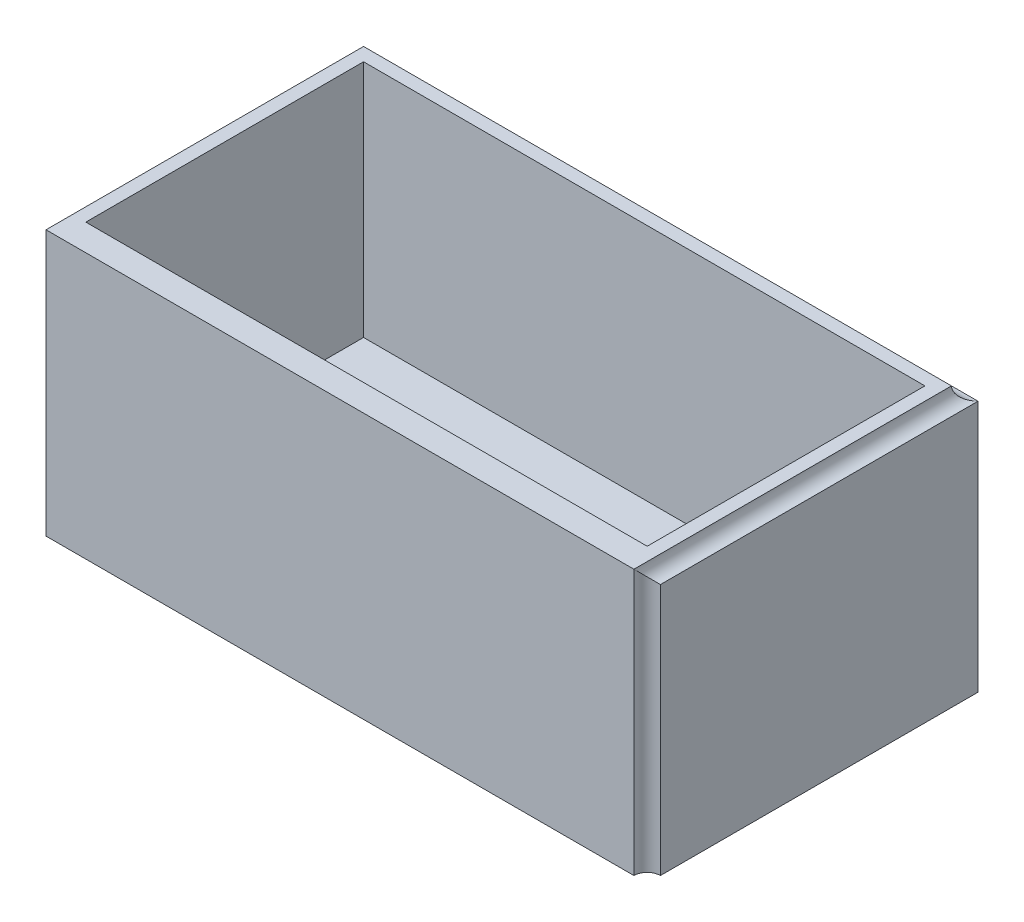
ISO-10303-21;
HEADER;
FILE_DESCRIPTION(('STEP AP214'),'2;1');
FILE_NAME('part.step','',(''),(''),'','','');
FILE_SCHEMA(('AUTOMOTIVE_DESIGN { 1 0 10303 214 1 1 1 1 }'));
ENDSEC;
DATA;
#1=APPLICATION_CONTEXT('core data for automotive mechanical design processes');
#2=APPLICATION_PROTOCOL_DEFINITION('international standard','automotive_design',2000,#1);
#3=PRODUCT_CONTEXT('',#1,'mechanical');
#4=PRODUCT('Part','Part','',(#3));
#5=PRODUCT_RELATED_PRODUCT_CATEGORY('part','',(#4));
#6=PRODUCT_DEFINITION_FORMATION('','',#4);
#7=PRODUCT_DEFINITION_CONTEXT('part definition',#1,'design');
#8=PRODUCT_DEFINITION('design','',#6,#7);
#9=PRODUCT_DEFINITION_SHAPE('','',#8);
#10=(LENGTH_UNIT() NAMED_UNIT(*) SI_UNIT(.MILLI.,.METRE.));
#11=(NAMED_UNIT(*) PLANE_ANGLE_UNIT() SI_UNIT($,.RADIAN.));
#12=(NAMED_UNIT(*) SI_UNIT($,.STERADIAN.) SOLID_ANGLE_UNIT());
#13=UNCERTAINTY_MEASURE_WITH_UNIT(LENGTH_MEASURE(1.E-05),#10,'distance_accuracy_value','');
#14=(GEOMETRIC_REPRESENTATION_CONTEXT(3) GLOBAL_UNCERTAINTY_ASSIGNED_CONTEXT((#13)) GLOBAL_UNIT_ASSIGNED_CONTEXT((#10,
#11,#12)) REPRESENTATION_CONTEXT('',''));
#15=CARTESIAN_POINT('',(0.,0.,0.));
#16=DIRECTION('',(0.,0.,1.));
#17=DIRECTION('',(1.,0.,0.));
#18=AXIS2_PLACEMENT_3D('',#15,#16,#17);
#19=CARTESIAN_POINT('',(-116.457407054503,50.,59.3396888919688));
#20=DIRECTION('',(0.,0.,-1.));
#21=DIRECTION('',(-1.,0.,0.));
#22=AXIS2_PLACEMENT_3D('',#19,#20,#21);
#23=PLANE('',#22);
#24=DIRECTION('',(0.,-1.,0.));
#25=VECTOR('',#24,1.);
#26=CARTESIAN_POINT('',(-111.457407054503,55.6,59.3396888919688));
#27=LINE('',#26,#25);
#28=CARTESIAN_POINT('',(-111.457407054503,-50.,59.3396888919688));
#29=VERTEX_POINT('',#28);
#30=CARTESIAN_POINT('',(-111.457407054503,50.,59.3396888919688));
#31=VERTEX_POINT('',#30);
#32=EDGE_CURVE('E200',#29,#31,#27,.F.);
#33=ORIENTED_EDGE('',*,*,#32,.F.);
#34=DIRECTION('',(1.,0.,0.));
#35=VECTOR('',#34,1.);
#36=CARTESIAN_POINT('',(-116.457407054503,-50.,59.3396888919688));
#37=LINE('',#36,#35);
#38=CARTESIAN_POINT('',(110.150365448953,-50.,59.3396888919688));
#39=VERTEX_POINT('',#38);
#40=EDGE_CURVE('E161',#29,#39,#37,.T.);
#41=ORIENTED_EDGE('',*,*,#40,.T.);
#42=DIRECTION('',(0.,1.,0.));
#43=VECTOR('',#42,1.);
#44=CARTESIAN_POINT('',(110.150365448953,-55.0000000000003,59.3396888919688));
#45=LINE('',#44,#43);
#46=CARTESIAN_POINT('',(110.150365448953,50.,59.3396888919688));
#47=VERTEX_POINT('',#46);
#48=EDGE_CURVE('E141',#47,#39,#45,.F.);
#49=ORIENTED_EDGE('',*,*,#48,.F.);
#50=DIRECTION('',(1.,0.,0.));
#51=VECTOR('',#50,1.);
#52=CARTESIAN_POINT('',(-116.457407054503,50.,59.3396888919688));
#53=LINE('',#52,#51);
#54=EDGE_CURVE('E163',#31,#47,#53,.T.);
#55=ORIENTED_EDGE('',*,*,#54,.F.);
#56=EDGE_LOOP('',(#33,#41,#49,#55));
#57=FACE_BOUND('',#56,.T.);
#58=ADVANCED_FACE('F51',(#57),#23,.F.);
#59=CARTESIAN_POINT('',(115.150365448953,50.,-65.3520802774987));
#60=DIRECTION('',(-1.,0.,0.));
#61=DIRECTION('',(0.,0.,1.));
#62=AXIS2_PLACEMENT_3D('',#59,#60,#61);
#63=PLANE('',#62);
#64=DIRECTION('',(0.,0.,-1.));
#65=VECTOR('',#64,1.);
#66=CARTESIAN_POINT('',(115.150365448953,45.,64.9396888919689));
#67=LINE('',#66,#65);
#68=CARTESIAN_POINT('',(115.150365448953,45.,54.3396888919688));
#69=VERTEX_POINT('',#68);
#70=CARTESIAN_POINT('',(115.150365448953,45.,-65.3520802774987));
#71=VERTEX_POINT('',#70);
#72=EDGE_CURVE('E155',#69,#71,#67,.T.);
#73=ORIENTED_EDGE('',*,*,#72,.F.);
#74=DIRECTION('',(0.,1.,0.));
#75=VECTOR('',#74,1.);
#76=CARTESIAN_POINT('',(115.150365448953,-55.0000000000003,54.3396888919688));
#77=LINE('',#76,#75);
#78=CARTESIAN_POINT('',(115.150365448953,-50.,54.3396888919688));
#79=VERTEX_POINT('',#78);
#80=EDGE_CURVE('E138',#79,#69,#77,.T.);
#81=ORIENTED_EDGE('',*,*,#80,.F.);
#82=DIRECTION('',(0.,0.,-1.));
#83=VECTOR('',#82,1.);
#84=CARTESIAN_POINT('',(115.150365448953,-50.,-65.3520802774987));
#85=LINE('',#84,#83);
#86=CARTESIAN_POINT('',(115.150365448953,-50.,-65.3520802774987));
#87=VERTEX_POINT('',#86);
#88=EDGE_CURVE('E153',#79,#87,#85,.T.);
#89=ORIENTED_EDGE('',*,*,#88,.T.);
#90=DIRECTION('',(0.,-1.,0.));
#91=VECTOR('',#90,1.);
#92=CARTESIAN_POINT('',(115.150365448953,50.,-65.3520802774987));
#93=LINE('',#92,#91);
#94=EDGE_CURVE('E171',#71,#87,#93,.T.);
#95=ORIENTED_EDGE('',*,*,#94,.F.);
#96=EDGE_LOOP('',(#73,#81,#89,#95));
#97=FACE_BOUND('',#96,.T.);
#98=ADVANCED_FACE('F151',(#97),#63,.F.);
#99=CARTESIAN_POINT('',(0.,-50.,0.));
#100=DIRECTION('',(0.,1.,0.));
#101=DIRECTION('',(0.,0.,1.));
#102=AXIS2_PLACEMENT_3D('',#99,#100,#101);
#103=PLANE('',#102);
#104=ORIENTED_EDGE('',*,*,#40,.F.);
#105=CARTESIAN_POINT('',(-116.457407054503,-50.,59.3396888919688));
#106=DIRECTION('',(0.,1.,0.));
#107=DIRECTION('',(0.,0.,1.));
#108=AXIS2_PLACEMENT_3D('',#105,#106,#107);
#109=CIRCLE('',#108,5.);
#110=CARTESIAN_POINT('',(-116.457407054503,-50.,54.3396888919688));
#111=VERTEX_POINT('',#110);
#112=EDGE_CURVE('E193',#29,#111,#109,.T.);
#113=ORIENTED_EDGE('',*,*,#112,.T.);
#114=DIRECTION('',(0.,0.,1.));
#115=VECTOR('',#114,1.);
#116=CARTESIAN_POINT('',(-116.457407054503,-50.,-65.3520802774987));
#117=LINE('',#116,#115);
#118=CARTESIAN_POINT('',(-116.457407054503,-50.,-65.3520802774987));
#119=VERTEX_POINT('',#118);
#120=EDGE_CURVE('E165',#119,#111,#117,.T.);
#121=ORIENTED_EDGE('',*,*,#120,.F.);
#122=DIRECTION('',(-1.,0.,0.));
#123=VECTOR('',#122,1.);
#124=CARTESIAN_POINT('',(-116.457407054503,-50.,-65.3520802774987));
#125=LINE('',#124,#123);
#126=EDGE_CURVE('E160',#87,#119,#125,.T.);
#127=ORIENTED_EDGE('',*,*,#126,.F.);
#128=ORIENTED_EDGE('',*,*,#88,.F.);
#129=CARTESIAN_POINT('',(115.150365448953,-50.,59.3396888919688));
#130=DIRECTION('',(0.,1.,0.));
#131=DIRECTION('',(0.,0.,1.));
#132=AXIS2_PLACEMENT_3D('',#129,#130,#131);
#133=CIRCLE('',#132,5.);
#134=EDGE_CURVE('E134',#79,#39,#133,.T.);
#135=ORIENTED_EDGE('',*,*,#134,.T.);
#136=EDGE_LOOP('',(#104,#113,#121,#127,#128,#135));
#137=FACE_BOUND('',#136,.T.);
#138=ADVANCED_FACE('F157',(#137),#103,.F.);
#139=CARTESIAN_POINT('',(-116.457407054503,50.,-65.3520802774987));
#140=DIRECTION('',(1.,0.,0.));
#141=DIRECTION('',(0.,0.,-1.));
#142=AXIS2_PLACEMENT_3D('',#139,#140,#141);
#143=PLANE('',#142);
#144=DIRECTION('',(0.,-1.,0.));
#145=VECTOR('',#144,1.);
#146=CARTESIAN_POINT('',(-116.457407054503,55.6,54.3396888919688));
#147=LINE('',#146,#145);
#148=CARTESIAN_POINT('',(-116.457407054503,45.,54.3396888919688));
#149=VERTEX_POINT('',#148);
#150=EDGE_CURVE('E202',#149,#111,#147,.T.);
#151=ORIENTED_EDGE('',*,*,#150,.F.);
#152=DIRECTION('',(0.,0.,1.));
#153=VECTOR('',#152,1.);
#154=CARTESIAN_POINT('',(-116.457407054503,45.,-76.4520802774987));
#155=LINE('',#154,#153);
#156=CARTESIAN_POINT('',(-116.457407054503,45.,-65.3520802774987));
#157=VERTEX_POINT('',#156);
#158=EDGE_CURVE('E206',#157,#149,#155,.T.);
#159=ORIENTED_EDGE('',*,*,#158,.F.);
#160=DIRECTION('',(0.,-1.,0.));
#161=VECTOR('',#160,1.);
#162=CARTESIAN_POINT('',(-116.457407054503,50.,-65.3520802774987));
#163=LINE('',#162,#161);
#164=EDGE_CURVE('E169',#157,#119,#163,.T.);
#165=ORIENTED_EDGE('',*,*,#164,.T.);
#166=ORIENTED_EDGE('',*,*,#120,.T.);
#167=EDGE_LOOP('',(#151,#159,#165,#166));
#168=FACE_BOUND('',#167,.T.);
#169=ADVANCED_FACE('F53',(#168),#143,.F.);
#170=CARTESIAN_POINT('',(-116.457407054503,50.,-65.3520802774987));
#171=DIRECTION('',(0.,0.,1.));
#172=DIRECTION('',(1.,0.,0.));
#173=AXIS2_PLACEMENT_3D('',#170,#171,#172);
#174=PLANE('',#173);
#175=DIRECTION('',(-1.,0.,0.));
#176=VECTOR('',#175,1.);
#177=CARTESIAN_POINT('',(126.250365448953,45.,-65.3520802774987));
#178=LINE('',#177,#176);
#179=EDGE_CURVE('E186',#71,#157,#178,.T.);
#180=ORIENTED_EDGE('',*,*,#179,.F.);
#181=ORIENTED_EDGE('',*,*,#94,.T.);
#182=ORIENTED_EDGE('',*,*,#126,.T.);
#183=ORIENTED_EDGE('',*,*,#164,.F.);
#184=EDGE_LOOP('',(#180,#181,#182,#183));
#185=FACE_BOUND('',#184,.T.);
#186=ADVANCED_FACE('F250',(#185),#174,.F.);
#187=CARTESIAN_POINT('',(0.,50.,0.));
#188=DIRECTION('',(0.,1.,0.));
#189=DIRECTION('',(0.,0.,1.));
#190=AXIS2_PLACEMENT_3D('',#187,#188,#189);
#191=PLANE('',#190);
#192=DIRECTION('',(0.,0.,1.));
#193=VECTOR('',#192,1.);
#194=CARTESIAN_POINT('',(-106.457407054503,50.,-65.3520802774987));
#195=LINE('',#194,#193);
#196=CARTESIAN_POINT('',(-106.457407054503,50.,-55.3520802774987));
#197=VERTEX_POINT('',#196);
#198=CARTESIAN_POINT('',(-106.457407054503,50.,49.3396888919688));
#199=VERTEX_POINT('',#198);
#200=EDGE_CURVE('E228',#197,#199,#195,.T.);
#201=ORIENTED_EDGE('',*,*,#200,.F.);
#202=DIRECTION('',(-1.,0.,0.));
#203=VECTOR('',#202,1.);
#204=CARTESIAN_POINT('',(-116.457407054503,50.,-55.3520802774987));
#205=LINE('',#204,#203);
#206=CARTESIAN_POINT('',(105.150365448953,50.,-55.3520802774987));
#207=VERTEX_POINT('',#206);
#208=EDGE_CURVE('E219',#207,#197,#205,.T.);
#209=ORIENTED_EDGE('',*,*,#208,.F.);
#210=DIRECTION('',(0.,0.,-1.));
#211=VECTOR('',#210,1.);
#212=CARTESIAN_POINT('',(105.150365448953,50.,-65.3520802774987));
#213=LINE('',#212,#211);
#214=CARTESIAN_POINT('',(105.150365448953,50.,49.3396888919688));
#215=VERTEX_POINT('',#214);
#216=EDGE_CURVE('E232',#215,#207,#213,.T.);
#217=ORIENTED_EDGE('',*,*,#216,.F.);
#218=DIRECTION('',(1.,0.,0.));
#219=VECTOR('',#218,1.);
#220=CARTESIAN_POINT('',(-116.457407054503,50.,49.3396888919688));
#221=LINE('',#220,#219);
#222=EDGE_CURVE('E230',#199,#215,#221,.T.);
#223=ORIENTED_EDGE('',*,*,#222,.F.);
#224=EDGE_LOOP('',(#201,#209,#217,#223));
#225=FACE_BOUND('',#224,.T.);
#226=DIRECTION('',(-1.,0.,0.));
#227=VECTOR('',#226,1.);
#228=CARTESIAN_POINT('',(126.250365448953,50.,-60.3520802774987));
#229=LINE('',#228,#227);
#230=CARTESIAN_POINT('',(110.150365448953,50.,-60.3520802774987));
#231=VERTEX_POINT('',#230);
#232=CARTESIAN_POINT('',(-111.457407054503,50.,-60.3520802774987));
#233=VERTEX_POINT('',#232);
#234=EDGE_CURVE('E59',#231,#233,#229,.T.);
#235=ORIENTED_EDGE('',*,*,#234,.T.);
#236=DIRECTION('',(0.,0.,1.));
#237=VECTOR('',#236,1.);
#238=CARTESIAN_POINT('',(-111.457407054503,50.,-76.4520802774987));
#239=LINE('',#238,#237);
#240=EDGE_CURVE('E12',#233,#31,#239,.T.);
#241=ORIENTED_EDGE('',*,*,#240,.T.);
#242=ORIENTED_EDGE('',*,*,#54,.T.);
#243=DIRECTION('',(0.,0.,-1.));
#244=VECTOR('',#243,1.);
#245=CARTESIAN_POINT('',(110.150365448953,50.,64.9396888919689));
#246=LINE('',#245,#244);
#247=EDGE_CURVE('E173',#47,#231,#246,.T.);
#248=ORIENTED_EDGE('',*,*,#247,.T.);
#249=EDGE_LOOP('',(#235,#241,#242,#248));
#250=FACE_BOUND('',#249,.T.);
#251=ADVANCED_FACE('F177',(#225,#250),#191,.T.);
#252=CARTESIAN_POINT('',(-106.457407054503,50.,-65.3520802774987));
#253=DIRECTION('',(1.,0.,0.));
#254=DIRECTION('',(0.,0.,-1.));
#255=AXIS2_PLACEMENT_3D('',#252,#253,#254);
#256=PLANE('',#255);
#257=DIRECTION('',(0.,0.,1.));
#258=VECTOR('',#257,1.);
#259=CARTESIAN_POINT('',(-106.457407054503,-40.,-65.3520802774987));
#260=LINE('',#259,#258);
#261=CARTESIAN_POINT('',(-106.457407054503,-40.,-55.3520802774987));
#262=VERTEX_POINT('',#261);
#263=CARTESIAN_POINT('',(-106.457407054503,-40.,49.3396888919688));
#264=VERTEX_POINT('',#263);
#265=EDGE_CURVE('E208',#262,#264,#260,.T.);
#266=ORIENTED_EDGE('',*,*,#265,.F.);
#267=DIRECTION('',(0.,-1.,0.));
#268=VECTOR('',#267,1.);
#269=CARTESIAN_POINT('',(-106.457407054503,50.,-55.3520802774987));
#270=LINE('',#269,#268);
#271=EDGE_CURVE('E216',#197,#262,#270,.T.);
#272=ORIENTED_EDGE('',*,*,#271,.F.);
#273=ORIENTED_EDGE('',*,*,#200,.T.);
#274=DIRECTION('',(0.,-1.,0.));
#275=VECTOR('',#274,1.);
#276=CARTESIAN_POINT('',(-106.457407054503,50.,49.3396888919688));
#277=LINE('',#276,#275);
#278=EDGE_CURVE('E212',#199,#264,#277,.T.);
#279=ORIENTED_EDGE('',*,*,#278,.T.);
#280=EDGE_LOOP('',(#266,#272,#273,#279));
#281=FACE_BOUND('',#280,.T.);
#282=ADVANCED_FACE('F258',(#281),#256,.T.);
#283=CARTESIAN_POINT('',(-116.457407054503,50.,49.3396888919688));
#284=DIRECTION('',(0.,0.,-1.));
#285=DIRECTION('',(-1.,0.,0.));
#286=AXIS2_PLACEMENT_3D('',#283,#284,#285);
#287=PLANE('',#286);
#288=DIRECTION('',(1.,0.,0.));
#289=VECTOR('',#288,1.);
#290=CARTESIAN_POINT('',(-116.457407054503,-40.,49.3396888919688));
#291=LINE('',#290,#289);
#292=CARTESIAN_POINT('',(105.150365448953,-40.,49.3396888919688));
#293=VERTEX_POINT('',#292);
#294=EDGE_CURVE('E211',#264,#293,#291,.T.);
#295=ORIENTED_EDGE('',*,*,#294,.F.);
#296=ORIENTED_EDGE('',*,*,#278,.F.);
#297=ORIENTED_EDGE('',*,*,#222,.T.);
#298=DIRECTION('',(0.,-1.,0.));
#299=VECTOR('',#298,1.);
#300=CARTESIAN_POINT('',(105.150365448953,50.,49.3396888919688));
#301=LINE('',#300,#299);
#302=EDGE_CURVE('E215',#215,#293,#301,.T.);
#303=ORIENTED_EDGE('',*,*,#302,.T.);
#304=EDGE_LOOP('',(#295,#296,#297,#303));
#305=FACE_BOUND('',#304,.T.);
#306=ADVANCED_FACE('F271',(#305),#287,.T.);
#307=CARTESIAN_POINT('',(105.150365448953,50.,-65.3520802774987));
#308=DIRECTION('',(-1.,0.,0.));
#309=DIRECTION('',(0.,0.,1.));
#310=AXIS2_PLACEMENT_3D('',#307,#308,#309);
#311=PLANE('',#310);
#312=DIRECTION('',(0.,0.,-1.));
#313=VECTOR('',#312,1.);
#314=CARTESIAN_POINT('',(105.150365448953,-40.,-65.3520802774987));
#315=LINE('',#314,#313);
#316=CARTESIAN_POINT('',(105.150365448953,-40.,-55.3520802774987));
#317=VERTEX_POINT('',#316);
#318=EDGE_CURVE('E221',#293,#317,#315,.T.);
#319=ORIENTED_EDGE('',*,*,#318,.F.);
#320=ORIENTED_EDGE('',*,*,#302,.F.);
#321=ORIENTED_EDGE('',*,*,#216,.T.);
#322=DIRECTION('',(0.,-1.,0.));
#323=VECTOR('',#322,1.);
#324=CARTESIAN_POINT('',(105.150365448953,50.,-55.3520802774987));
#325=LINE('',#324,#323);
#326=EDGE_CURVE('E74',#207,#317,#325,.T.);
#327=ORIENTED_EDGE('',*,*,#326,.T.);
#328=EDGE_LOOP('',(#319,#320,#321,#327));
#329=FACE_BOUND('',#328,.T.);
#330=ADVANCED_FACE('F268',(#329),#311,.T.);
#331=CARTESIAN_POINT('',(-116.457407054503,50.,-55.3520802774987));
#332=DIRECTION('',(0.,0.,1.));
#333=DIRECTION('',(1.,0.,0.));
#334=AXIS2_PLACEMENT_3D('',#331,#332,#333);
#335=PLANE('',#334);
#336=DIRECTION('',(-1.,0.,0.));
#337=VECTOR('',#336,1.);
#338=CARTESIAN_POINT('',(-116.457407054503,-40.,-55.3520802774987));
#339=LINE('',#338,#337);
#340=EDGE_CURVE('E225',#317,#262,#339,.T.);
#341=ORIENTED_EDGE('',*,*,#340,.F.);
#342=ORIENTED_EDGE('',*,*,#326,.F.);
#343=ORIENTED_EDGE('',*,*,#208,.T.);
#344=ORIENTED_EDGE('',*,*,#271,.T.);
#345=EDGE_LOOP('',(#341,#342,#343,#344));
#346=FACE_BOUND('',#345,.T.);
#347=ADVANCED_FACE('F264',(#346),#335,.T.);
#348=CARTESIAN_POINT('',(0.,-40.,0.));
#349=DIRECTION('',(0.,1.,0.));
#350=DIRECTION('',(0.,0.,1.));
#351=AXIS2_PLACEMENT_3D('',#348,#349,#350);
#352=PLANE('',#351);
#353=ORIENTED_EDGE('',*,*,#265,.T.);
#354=ORIENTED_EDGE('',*,*,#294,.T.);
#355=ORIENTED_EDGE('',*,*,#318,.T.);
#356=ORIENTED_EDGE('',*,*,#340,.T.);
#357=EDGE_LOOP('',(#353,#354,#355,#356));
#358=FACE_BOUND('',#357,.T.);
#359=ADVANCED_FACE('F260',(#358),#352,.T.);
#360=CARTESIAN_POINT('',(-116.457407054503,50.,-76.4520802774987));
#361=DIRECTION('',(0.,0.,1.));
#362=DIRECTION('',(1.,0.,0.));
#363=AXIS2_PLACEMENT_3D('',#360,#361,#362);
#364=CYLINDRICAL_SURFACE('',#363,5.);
#365=ORIENTED_EDGE('',*,*,#158,.T.);
#366=CARTESIAN_POINT('',(-116.457407054503,50.,59.3396888919688));
#367=DIRECTION('',(0.,-0.707106781186548,0.707106781186548));
#368=DIRECTION('',(0.,0.707106781186548,0.707106781186548));
#369=AXIS2_PLACEMENT_3D('',#366,#367,#368);
#370=ELLIPSE('',#369,7.07106781186548,5.);
#371=EDGE_CURVE('E189',#149,#31,#370,.T.);
#372=ORIENTED_EDGE('',*,*,#371,.T.);
#373=ORIENTED_EDGE('',*,*,#240,.F.);
#374=CARTESIAN_POINT('',(-116.457407054503,50.,-65.3520802774987));
#375=DIRECTION('',(-0.707106781186548,0.,0.707106781186548));
#376=DIRECTION('',(-0.707106781186548,0.,-0.707106781186548));
#377=AXIS2_PLACEMENT_3D('',#374,#375,#376);
#378=ELLIPSE('',#377,7.07106781186548,5.);
#379=EDGE_CURVE('E185',#157,#233,#378,.T.);
#380=ORIENTED_EDGE('',*,*,#379,.F.);
#381=EDGE_LOOP('',(#365,#372,#373,#380));
#382=FACE_BOUND('',#381,.T.);
#383=ADVANCED_FACE('F263',(#382),#364,.F.);
#384=CARTESIAN_POINT('',(126.250365448953,50.,-65.3520802774987));
#385=DIRECTION('',(-1.,0.,0.));
#386=DIRECTION('',(0.,0.,1.));
#387=AXIS2_PLACEMENT_3D('',#384,#385,#386);
#388=CYLINDRICAL_SURFACE('',#387,5.);
#389=ORIENTED_EDGE('',*,*,#179,.T.);
#390=ORIENTED_EDGE('',*,*,#379,.T.);
#391=ORIENTED_EDGE('',*,*,#234,.F.);
#392=CARTESIAN_POINT('',(115.150365448953,50.,-65.3520802774987));
#393=DIRECTION('',(-0.707106781186548,0.,-0.707106781186548));
#394=DIRECTION('',(0.707106781186548,0.,-0.707106781186548));
#395=AXIS2_PLACEMENT_3D('',#392,#393,#394);
#396=ELLIPSE('',#395,7.07106781186548,5.);
#397=EDGE_CURVE('E66',#71,#231,#396,.T.);
#398=ORIENTED_EDGE('',*,*,#397,.F.);
#399=EDGE_LOOP('',(#389,#390,#391,#398));
#400=FACE_BOUND('',#399,.T.);
#401=ADVANCED_FACE('F182',(#400),#388,.F.);
#402=CARTESIAN_POINT('',(115.150365448953,50.,64.9396888919689));
#403=DIRECTION('',(0.,0.,-1.));
#404=DIRECTION('',(-1.,0.,0.));
#405=AXIS2_PLACEMENT_3D('',#402,#403,#404);
#406=CYLINDRICAL_SURFACE('',#405,5.);
#407=ORIENTED_EDGE('',*,*,#72,.T.);
#408=ORIENTED_EDGE('',*,*,#397,.T.);
#409=ORIENTED_EDGE('',*,*,#247,.F.);
#410=CARTESIAN_POINT('',(115.150365448953,50.,59.3396888919688));
#411=DIRECTION('',(0.,0.707106781186548,-0.707106781186548));
#412=DIRECTION('',(0.,0.707106781186548,0.707106781186548));
#413=AXIS2_PLACEMENT_3D('',#410,#411,#412);
#414=ELLIPSE('',#413,7.07106781186548,5.);
#415=EDGE_CURVE('E146',#69,#47,#414,.T.);
#416=ORIENTED_EDGE('',*,*,#415,.F.);
#417=EDGE_LOOP('',(#407,#408,#409,#416));
#418=FACE_BOUND('',#417,.T.);
#419=ADVANCED_FACE('F281',(#418),#406,.F.);
#420=CARTESIAN_POINT('',(-116.457407054503,55.6,59.3396888919688));
#421=DIRECTION('',(0.,-1.,0.));
#422=DIRECTION('',(0.,0.,-1.));
#423=AXIS2_PLACEMENT_3D('',#420,#421,#422);
#424=CYLINDRICAL_SURFACE('',#423,5.);
#425=ORIENTED_EDGE('',*,*,#150,.T.);
#426=ORIENTED_EDGE('',*,*,#112,.F.);
#427=ORIENTED_EDGE('',*,*,#32,.T.);
#428=ORIENTED_EDGE('',*,*,#371,.F.);
#429=EDGE_LOOP('',(#425,#426,#427,#428));
#430=FACE_BOUND('',#429,.T.);
#431=ADVANCED_FACE('F241',(#430),#424,.F.);
#432=CARTESIAN_POINT('',(115.150365448953,-55.0000000000003,59.3396888919688));
#433=DIRECTION('',(0.,1.,0.));
#434=DIRECTION('',(0.,0.,1.));
#435=AXIS2_PLACEMENT_3D('',#432,#433,#434);
#436=CYLINDRICAL_SURFACE('',#435,5.);
#437=ORIENTED_EDGE('',*,*,#48,.T.);
#438=ORIENTED_EDGE('',*,*,#134,.F.);
#439=ORIENTED_EDGE('',*,*,#80,.T.);
#440=ORIENTED_EDGE('',*,*,#415,.T.);
#441=EDGE_LOOP('',(#437,#438,#439,#440));
#442=FACE_BOUND('',#441,.T.);
#443=ADVANCED_FACE('F136',(#442),#436,.F.);
#444=CLOSED_SHELL('',(#58,#98,#138,#169,#186,#251,#282,#306,#330,#347,#359,#383,#401,#419,#431,#443));
#445=MANIFOLD_SOLID_BREP('B2',#444);
#446=ADVANCED_BREP_SHAPE_REPRESENTATION('',(#18,#445),#14);
#447=SHAPE_DEFINITION_REPRESENTATION(#9,#446);
ENDSEC;
END-ISO-10303-21;
